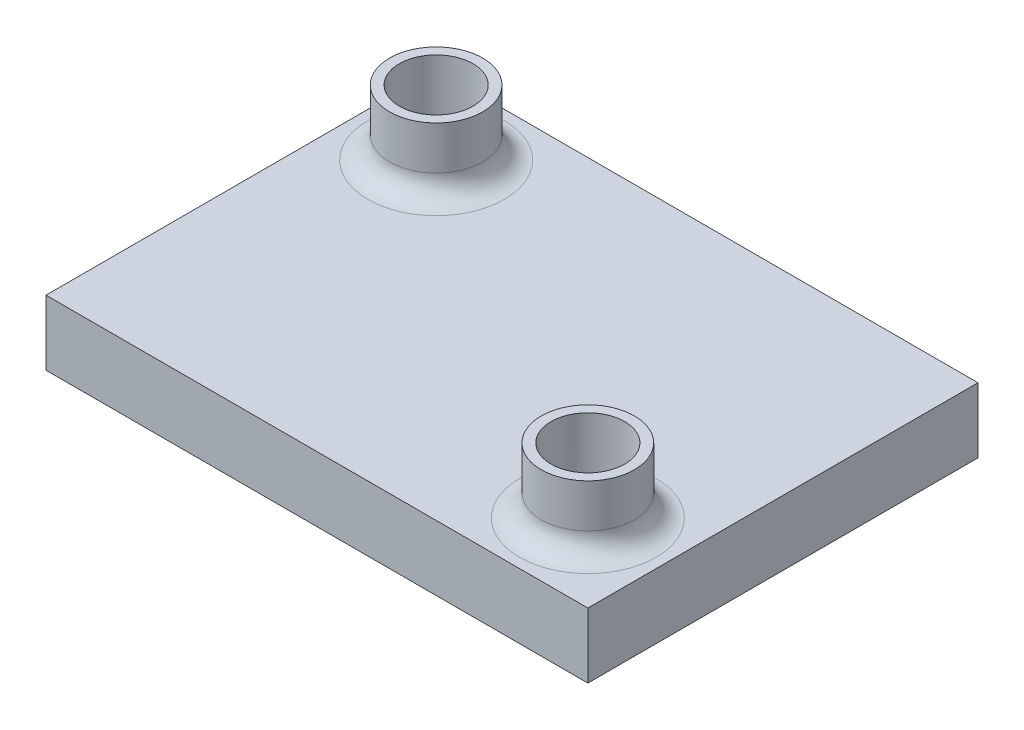
ISO-10303-21;
HEADER;
FILE_DESCRIPTION(('STEP AP214'),'2;1');
FILE_NAME('part.step','',(''),(''),'','','');
FILE_SCHEMA(('AUTOMOTIVE_DESIGN { 1 0 10303 214 1 1 1 1 }'));
ENDSEC;
DATA;
#1=APPLICATION_CONTEXT('core data for automotive mechanical design processes');
#2=APPLICATION_PROTOCOL_DEFINITION('international standard','automotive_design',2000,#1);
#3=PRODUCT_CONTEXT('',#1,'mechanical');
#4=PRODUCT('Part','Part','',(#3));
#5=PRODUCT_RELATED_PRODUCT_CATEGORY('part','',(#4));
#6=PRODUCT_DEFINITION_FORMATION('','',#4);
#7=PRODUCT_DEFINITION_CONTEXT('part definition',#1,'design');
#8=PRODUCT_DEFINITION('design','',#6,#7);
#9=PRODUCT_DEFINITION_SHAPE('','',#8);
#10=(LENGTH_UNIT() NAMED_UNIT(*) SI_UNIT(.MILLI.,.METRE.));
#11=(NAMED_UNIT(*) PLANE_ANGLE_UNIT() SI_UNIT($,.RADIAN.));
#12=(NAMED_UNIT(*) SI_UNIT($,.STERADIAN.) SOLID_ANGLE_UNIT());
#13=UNCERTAINTY_MEASURE_WITH_UNIT(LENGTH_MEASURE(1.E-05),#10,'distance_accuracy_value','');
#14=(GEOMETRIC_REPRESENTATION_CONTEXT(3) GLOBAL_UNCERTAINTY_ASSIGNED_CONTEXT((#13)) GLOBAL_UNIT_ASSIGNED_CONTEXT((#10,
#11,#12)) REPRESENTATION_CONTEXT('',''));
#15=CARTESIAN_POINT('',(0.,0.,0.));
#16=DIRECTION('',(0.,0.,1.));
#17=DIRECTION('',(1.,0.,0.));
#18=AXIS2_PLACEMENT_3D('',#15,#16,#17);
#19=CARTESIAN_POINT('',(-8.89989325778686,0.,-5.4));
#20=DIRECTION('',(0.,1.,0.));
#21=DIRECTION('',(0.,0.,1.));
#22=AXIS2_PLACEMENT_3D('',#19,#20,#21);
#23=CYLINDRICAL_SURFACE('',#22,1.7);
#24=CARTESIAN_POINT('',(-8.89989325778686,6.,-5.4));
#25=DIRECTION('',(0.,1.,0.));
#26=DIRECTION('',(0.,0.,1.));
#27=AXIS2_PLACEMENT_3D('',#24,#25,#26);
#28=CIRCLE('',#27,1.7);
#29=CARTESIAN_POINT('',(-8.89989325778686,6.,-3.7));
#30=VERTEX_POINT('',#29);
#31=EDGE_CURVE('E256',#30,#30,#28,.T.);
#32=ORIENTED_EDGE('',*,*,#31,.T.);
#33=EDGE_LOOP('',(#32));
#34=FACE_BOUND('',#33,.T.);
#35=CARTESIAN_POINT('',(-8.89989325778686,2.,-5.4));
#36=DIRECTION('',(0.,-1.,0.));
#37=DIRECTION('',(0.,0.,-1.));
#38=AXIS2_PLACEMENT_3D('',#35,#36,#37);
#39=CIRCLE('',#38,1.7);
#40=CARTESIAN_POINT('',(-8.89989325778686,2.,-7.1));
#41=VERTEX_POINT('',#40);
#42=EDGE_CURVE('E37',#41,#41,#39,.F.);
#43=ORIENTED_EDGE('',*,*,#42,.F.);
#44=EDGE_LOOP('',(#43));
#45=FACE_BOUND('',#44,.T.);
#46=ADVANCED_FACE('F33',(#34,#45),#23,.F.);
#47=CARTESIAN_POINT('',(8.89989325778686,0.,5.4));
#48=DIRECTION('',(0.,1.,0.));
#49=DIRECTION('',(0.,0.,1.));
#50=AXIS2_PLACEMENT_3D('',#47,#48,#49);
#51=CYLINDRICAL_SURFACE('',#50,1.7);
#52=CARTESIAN_POINT('',(8.89989325778686,6.,5.4));
#53=DIRECTION('',(0.,1.,0.));
#54=DIRECTION('',(0.,0.,1.));
#55=AXIS2_PLACEMENT_3D('',#52,#53,#54);
#56=CIRCLE('',#55,1.7);
#57=CARTESIAN_POINT('',(8.89989325778686,6.,7.1));
#58=VERTEX_POINT('',#57);
#59=EDGE_CURVE('E250',#58,#58,#56,.T.);
#60=ORIENTED_EDGE('',*,*,#59,.T.);
#61=EDGE_LOOP('',(#60));
#62=FACE_BOUND('',#61,.T.);
#63=CARTESIAN_POINT('',(8.89989325778686,2.,5.4));
#64=DIRECTION('',(0.,-1.,0.));
#65=DIRECTION('',(0.,0.,-1.));
#66=AXIS2_PLACEMENT_3D('',#63,#64,#65);
#67=CIRCLE('',#66,1.7);
#68=CARTESIAN_POINT('',(8.89989325778686,2.,3.7));
#69=VERTEX_POINT('',#68);
#70=EDGE_CURVE('E240',#69,#69,#67,.F.);
#71=ORIENTED_EDGE('',*,*,#70,.F.);
#72=EDGE_LOOP('',(#71));
#73=FACE_BOUND('',#72,.T.);
#74=ADVANCED_FACE('F304',(#62,#73),#51,.F.);
#75=CARTESIAN_POINT('',(0.,3.,0.));
#76=DIRECTION('',(0.,1.,0.));
#77=DIRECTION('',(0.,0.,1.));
#78=AXIS2_PLACEMENT_3D('',#75,#76,#77);
#79=PLANE('',#78);
#80=CARTESIAN_POINT('',(8.89989325778686,3.,5.4));
#81=DIRECTION('',(0.,1.,0.));
#82=DIRECTION('',(0.,0.,1.));
#83=AXIS2_PLACEMENT_3D('',#80,#81,#82);
#84=CIRCLE('',#83,3.15);
#85=CARTESIAN_POINT('',(8.89989325778686,3.,8.55));
#86=VERTEX_POINT('',#85);
#87=EDGE_CURVE('E42',#86,#86,#84,.F.);
#88=ORIENTED_EDGE('',*,*,#87,.T.);
#89=EDGE_LOOP('',(#88));
#90=FACE_BOUND('',#89,.T.);
#91=CARTESIAN_POINT('',(-8.89989325778686,3.,-5.4));
#92=DIRECTION('',(0.,1.,0.));
#93=DIRECTION('',(0.,0.,1.));
#94=AXIS2_PLACEMENT_3D('',#91,#92,#93);
#95=CIRCLE('',#94,3.15);
#96=CARTESIAN_POINT('',(-8.89989325778686,3.,-2.25));
#97=VERTEX_POINT('',#96);
#98=EDGE_CURVE('E295',#97,#97,#95,.F.);
#99=ORIENTED_EDGE('',*,*,#98,.T.);
#100=EDGE_LOOP('',(#99));
#101=FACE_BOUND('',#100,.T.);
#102=DIRECTION('',(0.,0.,1.));
#103=VECTOR('',#102,1.);
#104=CARTESIAN_POINT('',(-12.5,3.,-9.));
#105=LINE('',#104,#103);
#106=CARTESIAN_POINT('',(-12.5,3.,-9.));
#107=VERTEX_POINT('',#106);
#108=CARTESIAN_POINT('',(-12.5,3.,9.));
#109=VERTEX_POINT('',#108);
#110=EDGE_CURVE('E263',#107,#109,#105,.T.);
#111=ORIENTED_EDGE('',*,*,#110,.T.);
#112=DIRECTION('',(1.,0.,0.));
#113=VECTOR('',#112,1.);
#114=CARTESIAN_POINT('',(-12.5,3.,9.));
#115=LINE('',#114,#113);
#116=CARTESIAN_POINT('',(12.5,3.,9.));
#117=VERTEX_POINT('',#116);
#118=EDGE_CURVE('E266',#109,#117,#115,.T.);
#119=ORIENTED_EDGE('',*,*,#118,.T.);
#120=DIRECTION('',(0.,0.,-1.));
#121=VECTOR('',#120,1.);
#122=CARTESIAN_POINT('',(12.5,3.,-9.));
#123=LINE('',#122,#121);
#124=CARTESIAN_POINT('',(12.5,3.,-9.));
#125=VERTEX_POINT('',#124);
#126=EDGE_CURVE('E269',#117,#125,#123,.T.);
#127=ORIENTED_EDGE('',*,*,#126,.T.);
#128=DIRECTION('',(-1.,0.,0.));
#129=VECTOR('',#128,1.);
#130=CARTESIAN_POINT('',(-12.5,3.,-9.));
#131=LINE('',#130,#129);
#132=EDGE_CURVE('E271',#125,#107,#131,.T.);
#133=ORIENTED_EDGE('',*,*,#132,.T.);
#134=EDGE_LOOP('',(#111,#119,#127,#133));
#135=FACE_BOUND('',#134,.T.);
#136=ADVANCED_FACE('F306',(#90,#101,#135),#79,.T.);
#137=CARTESIAN_POINT('',(-12.5,3.,-9.));
#138=DIRECTION('',(1.,0.,0.));
#139=DIRECTION('',(0.,0.,-1.));
#140=AXIS2_PLACEMENT_3D('',#137,#138,#139);
#141=PLANE('',#140);
#142=DIRECTION('',(0.,0.,1.));
#143=VECTOR('',#142,1.);
#144=CARTESIAN_POINT('',(-12.5,0.,-9.));
#145=LINE('',#144,#143);
#146=CARTESIAN_POINT('',(-12.5,0.,-9.));
#147=VERTEX_POINT('',#146);
#148=CARTESIAN_POINT('',(-12.5,0.,9.));
#149=VERTEX_POINT('',#148);
#150=EDGE_CURVE('E262',#147,#149,#145,.T.);
#151=ORIENTED_EDGE('',*,*,#150,.T.);
#152=DIRECTION('',(0.,-1.,0.));
#153=VECTOR('',#152,1.);
#154=CARTESIAN_POINT('',(-12.5,3.,9.));
#155=LINE('',#154,#153);
#156=EDGE_CURVE('E289',#109,#149,#155,.T.);
#157=ORIENTED_EDGE('',*,*,#156,.F.);
#158=ORIENTED_EDGE('',*,*,#110,.F.);
#159=DIRECTION('',(0.,-1.,0.));
#160=VECTOR('',#159,1.);
#161=CARTESIAN_POINT('',(-12.5,3.,-9.));
#162=LINE('',#161,#160);
#163=EDGE_CURVE('E273',#107,#147,#162,.T.);
#164=ORIENTED_EDGE('',*,*,#163,.T.);
#165=EDGE_LOOP('',(#151,#157,#158,#164));
#166=FACE_BOUND('',#165,.T.);
#167=ADVANCED_FACE('F313',(#166),#141,.F.);
#168=CARTESIAN_POINT('',(-12.5,3.,9.));
#169=DIRECTION('',(0.,0.,-1.));
#170=DIRECTION('',(-1.,0.,0.));
#171=AXIS2_PLACEMENT_3D('',#168,#169,#170);
#172=PLANE('',#171);
#173=DIRECTION('',(1.,0.,0.));
#174=VECTOR('',#173,1.);
#175=CARTESIAN_POINT('',(-12.5,0.,9.));
#176=LINE('',#175,#174);
#177=CARTESIAN_POINT('',(12.5,0.,9.));
#178=VERTEX_POINT('',#177);
#179=EDGE_CURVE('E276',#149,#178,#176,.T.);
#180=ORIENTED_EDGE('',*,*,#179,.T.);
#181=DIRECTION('',(0.,-1.,0.));
#182=VECTOR('',#181,1.);
#183=CARTESIAN_POINT('',(12.5,3.,9.));
#184=LINE('',#183,#182);
#185=EDGE_CURVE('E286',#117,#178,#184,.T.);
#186=ORIENTED_EDGE('',*,*,#185,.F.);
#187=ORIENTED_EDGE('',*,*,#118,.F.);
#188=ORIENTED_EDGE('',*,*,#156,.T.);
#189=EDGE_LOOP('',(#180,#186,#187,#188));
#190=FACE_BOUND('',#189,.T.);
#191=ADVANCED_FACE('F334',(#190),#172,.F.);
#192=CARTESIAN_POINT('',(12.5,3.,-9.));
#193=DIRECTION('',(-1.,0.,0.));
#194=DIRECTION('',(0.,0.,1.));
#195=AXIS2_PLACEMENT_3D('',#192,#193,#194);
#196=PLANE('',#195);
#197=DIRECTION('',(0.,0.,-1.));
#198=VECTOR('',#197,1.);
#199=CARTESIAN_POINT('',(12.5,0.,-9.));
#200=LINE('',#199,#198);
#201=CARTESIAN_POINT('',(12.5,0.,-9.));
#202=VERTEX_POINT('',#201);
#203=EDGE_CURVE('E278',#178,#202,#200,.T.);
#204=ORIENTED_EDGE('',*,*,#203,.T.);
#205=DIRECTION('',(0.,-1.,0.));
#206=VECTOR('',#205,1.);
#207=CARTESIAN_POINT('',(12.5,3.,-9.));
#208=LINE('',#207,#206);
#209=EDGE_CURVE('E283',#125,#202,#208,.T.);
#210=ORIENTED_EDGE('',*,*,#209,.F.);
#211=ORIENTED_EDGE('',*,*,#126,.F.);
#212=ORIENTED_EDGE('',*,*,#185,.T.);
#213=EDGE_LOOP('',(#204,#210,#211,#212));
#214=FACE_BOUND('',#213,.T.);
#215=ADVANCED_FACE('F330',(#214),#196,.F.);
#216=CARTESIAN_POINT('',(-12.5,3.,-9.));
#217=DIRECTION('',(0.,0.,1.));
#218=DIRECTION('',(1.,0.,0.));
#219=AXIS2_PLACEMENT_3D('',#216,#217,#218);
#220=PLANE('',#219);
#221=DIRECTION('',(-1.,0.,0.));
#222=VECTOR('',#221,1.);
#223=CARTESIAN_POINT('',(-12.5,0.,-9.));
#224=LINE('',#223,#222);
#225=EDGE_CURVE('E267',#202,#147,#224,.T.);
#226=ORIENTED_EDGE('',*,*,#225,.T.);
#227=ORIENTED_EDGE('',*,*,#163,.F.);
#228=ORIENTED_EDGE('',*,*,#132,.F.);
#229=ORIENTED_EDGE('',*,*,#209,.T.);
#230=EDGE_LOOP('',(#226,#227,#228,#229));
#231=FACE_BOUND('',#230,.T.);
#232=ADVANCED_FACE('F326',(#231),#220,.F.);
#233=CARTESIAN_POINT('',(0.,0.,0.));
#234=DIRECTION('',(0.,1.,0.));
#235=DIRECTION('',(0.,0.,1.));
#236=AXIS2_PLACEMENT_3D('',#233,#234,#235);
#237=PLANE('',#236);
#238=DIRECTION('',(0.5,0.,0.866025403784439));
#239=VECTOR('',#238,1.);
#240=CARTESIAN_POINT('',(-7.25444499059643,0.,-8.25));
#241=LINE('',#240,#239);
#242=CARTESIAN_POINT('',(-7.25444499059643,0.,-8.25));
#243=VERTEX_POINT('',#242);
#244=CARTESIAN_POINT('',(-5.60899672340599,0.,-5.4));
#245=VERTEX_POINT('',#244);
#246=EDGE_CURVE('E184',#243,#245,#241,.T.);
#247=ORIENTED_EDGE('',*,*,#246,.F.);
#248=DIRECTION('',(1.,0.,0.));
#249=VECTOR('',#248,1.);
#250=CARTESIAN_POINT('',(-10.5453415249773,0.,-8.25));
#251=LINE('',#250,#249);
#252=CARTESIAN_POINT('',(-10.5453415249773,0.,-8.25));
#253=VERTEX_POINT('',#252);
#254=EDGE_CURVE('E50',#253,#243,#251,.T.);
#255=ORIENTED_EDGE('',*,*,#254,.F.);
#256=DIRECTION('',(0.5,0.,-0.866025403784439));
#257=VECTOR('',#256,1.);
#258=CARTESIAN_POINT('',(-12.1907897921677,0.,-5.4));
#259=LINE('',#258,#257);
#260=CARTESIAN_POINT('',(-12.1907897921677,0.,-5.4));
#261=VERTEX_POINT('',#260);
#262=EDGE_CURVE('E170',#261,#253,#259,.T.);
#263=ORIENTED_EDGE('',*,*,#262,.F.);
#264=DIRECTION('',(-0.5,0.,-0.866025403784439));
#265=VECTOR('',#264,1.);
#266=CARTESIAN_POINT('',(-10.5453415249773,0.,-2.55));
#267=LINE('',#266,#265);
#268=CARTESIAN_POINT('',(-10.5453415249773,0.,-2.55));
#269=VERTEX_POINT('',#268);
#270=EDGE_CURVE('E173',#269,#261,#267,.T.);
#271=ORIENTED_EDGE('',*,*,#270,.F.);
#272=DIRECTION('',(-1.,0.,0.));
#273=VECTOR('',#272,1.);
#274=CARTESIAN_POINT('',(-7.25444499059643,0.,-2.55));
#275=LINE('',#274,#273);
#276=CARTESIAN_POINT('',(-7.25444499059643,0.,-2.55));
#277=VERTEX_POINT('',#276);
#278=EDGE_CURVE('E189',#277,#269,#275,.T.);
#279=ORIENTED_EDGE('',*,*,#278,.F.);
#280=DIRECTION('',(-0.5,0.,0.866025403784439));
#281=VECTOR('',#280,1.);
#282=CARTESIAN_POINT('',(-5.60899672340599,0.,-5.4));
#283=LINE('',#282,#281);
#284=EDGE_CURVE('E186',#245,#277,#283,.T.);
#285=ORIENTED_EDGE('',*,*,#284,.F.);
#286=EDGE_LOOP('',(#247,#255,#263,#271,#279,#285));
#287=FACE_BOUND('',#286,.T.);
#288=DIRECTION('',(0.5,0.,0.866025403784438));
#289=VECTOR('',#288,1.);
#290=CARTESIAN_POINT('',(10.5453415249773,0.,2.55));
#291=LINE('',#290,#289);
#292=CARTESIAN_POINT('',(10.5453415249773,0.,2.55));
#293=VERTEX_POINT('',#292);
#294=CARTESIAN_POINT('',(12.1907897921677,0.,5.4));
#295=VERTEX_POINT('',#294);
#296=EDGE_CURVE('E224',#293,#295,#291,.T.);
#297=ORIENTED_EDGE('',*,*,#296,.F.);
#298=DIRECTION('',(1.,0.,0.));
#299=VECTOR('',#298,1.);
#300=CARTESIAN_POINT('',(7.25444499059642,0.,2.55));
#301=LINE('',#300,#299);
#302=CARTESIAN_POINT('',(7.25444499059642,0.,2.55));
#303=VERTEX_POINT('',#302);
#304=EDGE_CURVE('E58',#303,#293,#301,.T.);
#305=ORIENTED_EDGE('',*,*,#304,.F.);
#306=DIRECTION('',(0.5,0.,-0.866025403784439));
#307=VECTOR('',#306,1.);
#308=CARTESIAN_POINT('',(5.60899672340599,0.,5.4));
#309=LINE('',#308,#307);
#310=CARTESIAN_POINT('',(5.60899672340599,0.,5.4));
#311=VERTEX_POINT('',#310);
#312=EDGE_CURVE('E207',#311,#303,#309,.T.);
#313=ORIENTED_EDGE('',*,*,#312,.F.);
#314=DIRECTION('',(-0.5,0.,-0.866025403784438));
#315=VECTOR('',#314,1.);
#316=CARTESIAN_POINT('',(7.25444499059642,0.,8.25));
#317=LINE('',#316,#315);
#318=CARTESIAN_POINT('',(7.25444499059642,0.,8.25));
#319=VERTEX_POINT('',#318);
#320=EDGE_CURVE('E233',#319,#311,#317,.T.);
#321=ORIENTED_EDGE('',*,*,#320,.F.);
#322=DIRECTION('',(-1.,0.,0.));
#323=VECTOR('',#322,1.);
#324=CARTESIAN_POINT('',(10.5453415249773,0.,8.25));
#325=LINE('',#324,#323);
#326=CARTESIAN_POINT('',(10.5453415249773,0.,8.25));
#327=VERTEX_POINT('',#326);
#328=EDGE_CURVE('E230',#327,#319,#325,.T.);
#329=ORIENTED_EDGE('',*,*,#328,.F.);
#330=DIRECTION('',(-0.5,0.,0.866025403784439));
#331=VECTOR('',#330,1.);
#332=CARTESIAN_POINT('',(12.1907897921677,0.,5.4));
#333=LINE('',#332,#331);
#334=EDGE_CURVE('E227',#295,#327,#333,.T.);
#335=ORIENTED_EDGE('',*,*,#334,.F.);
#336=EDGE_LOOP('',(#297,#305,#313,#321,#329,#335));
#337=FACE_BOUND('',#336,.T.);
#338=ORIENTED_EDGE('',*,*,#150,.F.);
#339=ORIENTED_EDGE('',*,*,#225,.F.);
#340=ORIENTED_EDGE('',*,*,#203,.F.);
#341=ORIENTED_EDGE('',*,*,#179,.F.);
#342=EDGE_LOOP('',(#338,#339,#340,#341));
#343=FACE_BOUND('',#342,.T.);
#344=ADVANCED_FACE('F322',(#287,#337,#343),#237,.F.);
#345=CARTESIAN_POINT('',(-8.89989325778686,6.,-5.4));
#346=DIRECTION('',(0.,1.,0.));
#347=DIRECTION('',(0.,0.,1.));
#348=AXIS2_PLACEMENT_3D('',#345,#346,#347);
#349=PLANE('',#348);
#350=CARTESIAN_POINT('',(-8.89989325778686,6.,-5.4));
#351=DIRECTION('',(0.,1.,0.));
#352=DIRECTION('',(0.,0.,1.));
#353=AXIS2_PLACEMENT_3D('',#350,#351,#352);
#354=CIRCLE('',#353,2.15);
#355=CARTESIAN_POINT('',(-8.89989325778686,6.,-3.25));
#356=VERTEX_POINT('',#355);
#357=EDGE_CURVE('E259',#356,#356,#354,.T.);
#358=ORIENTED_EDGE('',*,*,#357,.T.);
#359=EDGE_LOOP('',(#358));
#360=FACE_BOUND('',#359,.T.);
#361=ORIENTED_EDGE('',*,*,#31,.F.);
#362=EDGE_LOOP('',(#361));
#363=FACE_BOUND('',#362,.T.);
#364=ADVANCED_FACE('F325',(#360,#363),#349,.T.);
#365=CARTESIAN_POINT('',(-8.89989325778686,6.,-5.4));
#366=DIRECTION('',(0.,-1.,0.));
#367=DIRECTION('',(0.,0.,-1.));
#368=AXIS2_PLACEMENT_3D('',#365,#366,#367);
#369=CYLINDRICAL_SURFACE('',#368,2.15);
#370=CARTESIAN_POINT('',(-8.89989325778686,4.,-5.4));
#371=DIRECTION('',(0.,1.,0.));
#372=DIRECTION('',(0.,0.,1.));
#373=AXIS2_PLACEMENT_3D('',#370,#371,#372);
#374=CIRCLE('',#373,2.15);
#375=CARTESIAN_POINT('',(-8.89989325778686,4.,-3.25));
#376=VERTEX_POINT('',#375);
#377=EDGE_CURVE('E11',#376,#376,#374,.T.);
#378=ORIENTED_EDGE('',*,*,#377,.T.);
#379=EDGE_LOOP('',(#378));
#380=FACE_BOUND('',#379,.T.);
#381=ORIENTED_EDGE('',*,*,#357,.F.);
#382=EDGE_LOOP('',(#381));
#383=FACE_BOUND('',#382,.T.);
#384=ADVANCED_FACE('F319',(#380,#383),#369,.T.);
#385=CARTESIAN_POINT('',(8.89989325778686,6.,5.4));
#386=DIRECTION('',(0.,1.,0.));
#387=DIRECTION('',(0.,0.,1.));
#388=AXIS2_PLACEMENT_3D('',#385,#386,#387);
#389=PLANE('',#388);
#390=CARTESIAN_POINT('',(8.89989325778686,6.,5.4));
#391=DIRECTION('',(0.,1.,0.));
#392=DIRECTION('',(0.,0.,1.));
#393=AXIS2_PLACEMENT_3D('',#390,#391,#392);
#394=CIRCLE('',#393,2.15);
#395=CARTESIAN_POINT('',(8.89989325778686,6.,7.55));
#396=VERTEX_POINT('',#395);
#397=EDGE_CURVE('E253',#396,#396,#394,.T.);
#398=ORIENTED_EDGE('',*,*,#397,.T.);
#399=EDGE_LOOP('',(#398));
#400=FACE_BOUND('',#399,.T.);
#401=ORIENTED_EDGE('',*,*,#59,.F.);
#402=EDGE_LOOP('',(#401));
#403=FACE_BOUND('',#402,.T.);
#404=ADVANCED_FACE('F350',(#400,#403),#389,.T.);
#405=CARTESIAN_POINT('',(8.89989325778686,6.,5.4));
#406=DIRECTION('',(0.,-1.,0.));
#407=DIRECTION('',(0.,0.,-1.));
#408=AXIS2_PLACEMENT_3D('',#405,#406,#407);
#409=CYLINDRICAL_SURFACE('',#408,2.15);
#410=CARTESIAN_POINT('',(8.89989325778686,4.,5.4));
#411=DIRECTION('',(0.,1.,0.));
#412=DIRECTION('',(0.,0.,1.));
#413=AXIS2_PLACEMENT_3D('',#410,#411,#412);
#414=CIRCLE('',#413,2.15);
#415=CARTESIAN_POINT('',(8.89989325778686,4.,7.55));
#416=VERTEX_POINT('',#415);
#417=EDGE_CURVE('E292',#416,#416,#414,.T.);
#418=ORIENTED_EDGE('',*,*,#417,.T.);
#419=EDGE_LOOP('',(#418));
#420=FACE_BOUND('',#419,.T.);
#421=ORIENTED_EDGE('',*,*,#397,.F.);
#422=EDGE_LOOP('',(#421));
#423=FACE_BOUND('',#422,.T.);
#424=ADVANCED_FACE('F343',(#420,#423),#409,.T.);
#425=CARTESIAN_POINT('',(8.89989325778686,4.,5.4));
#426=DIRECTION('',(0.,1.,0.));
#427=DIRECTION('',(0.,0.,1.));
#428=AXIS2_PLACEMENT_3D('',#425,#426,#427);
#429=TOROIDAL_SURFACE('',#428,3.15,1.);
#430=ORIENTED_EDGE('',*,*,#87,.F.);
#431=EDGE_LOOP('',(#430));
#432=FACE_BOUND('',#431,.T.);
#433=ORIENTED_EDGE('',*,*,#417,.F.);
#434=EDGE_LOOP('',(#433));
#435=FACE_BOUND('',#434,.T.);
#436=ADVANCED_FACE('F341',(#432,#435),#429,.F.);
#437=CARTESIAN_POINT('',(-8.89989325778686,4.,-5.4));
#438=DIRECTION('',(0.,1.,0.));
#439=DIRECTION('',(0.,0.,1.));
#440=AXIS2_PLACEMENT_3D('',#437,#438,#439);
#441=TOROIDAL_SURFACE('',#440,3.15,1.);
#442=ORIENTED_EDGE('',*,*,#98,.F.);
#443=EDGE_LOOP('',(#442));
#444=FACE_BOUND('',#443,.T.);
#445=ORIENTED_EDGE('',*,*,#377,.F.);
#446=EDGE_LOOP('',(#445));
#447=FACE_BOUND('',#446,.T.);
#448=ADVANCED_FACE('F35',(#444,#447),#441,.F.);
#449=CARTESIAN_POINT('',(0.,2.,0.));
#450=DIRECTION('',(0.,-1.,0.));
#451=DIRECTION('',(0.,0.,-1.));
#452=AXIS2_PLACEMENT_3D('',#449,#450,#451);
#453=PLANE('',#452);
#454=DIRECTION('',(1.,0.,0.));
#455=VECTOR('',#454,1.);
#456=CARTESIAN_POINT('',(7.25444499059642,2.,2.55));
#457=LINE('',#456,#455);
#458=CARTESIAN_POINT('',(7.25444499059642,2.,2.55));
#459=VERTEX_POINT('',#458);
#460=CARTESIAN_POINT('',(10.5453415249773,2.,2.55));
#461=VERTEX_POINT('',#460);
#462=EDGE_CURVE('E203',#459,#461,#457,.T.);
#463=ORIENTED_EDGE('',*,*,#462,.T.);
#464=DIRECTION('',(0.5,0.,0.866025403784438));
#465=VECTOR('',#464,1.);
#466=CARTESIAN_POINT('',(10.5453415249773,2.,2.55));
#467=LINE('',#466,#465);
#468=CARTESIAN_POINT('',(12.1907897921677,2.,5.4));
#469=VERTEX_POINT('',#468);
#470=EDGE_CURVE('E206',#461,#469,#467,.T.);
#471=ORIENTED_EDGE('',*,*,#470,.T.);
#472=DIRECTION('',(-0.5,0.,0.866025403784439));
#473=VECTOR('',#472,1.);
#474=CARTESIAN_POINT('',(12.1907897921677,2.,5.4));
#475=LINE('',#474,#473);
#476=CARTESIAN_POINT('',(10.5453415249773,2.,8.25));
#477=VERTEX_POINT('',#476);
#478=EDGE_CURVE('E210',#469,#477,#475,.T.);
#479=ORIENTED_EDGE('',*,*,#478,.T.);
#480=DIRECTION('',(-1.,0.,0.));
#481=VECTOR('',#480,1.);
#482=CARTESIAN_POINT('',(10.5453415249773,2.,8.25));
#483=LINE('',#482,#481);
#484=CARTESIAN_POINT('',(7.25444499059642,2.,8.25));
#485=VERTEX_POINT('',#484);
#486=EDGE_CURVE('E213',#477,#485,#483,.T.);
#487=ORIENTED_EDGE('',*,*,#486,.T.);
#488=DIRECTION('',(-0.5,0.,-0.866025403784438));
#489=VECTOR('',#488,1.);
#490=CARTESIAN_POINT('',(7.25444499059642,2.,8.25));
#491=LINE('',#490,#489);
#492=CARTESIAN_POINT('',(5.60899672340599,2.,5.4));
#493=VERTEX_POINT('',#492);
#494=EDGE_CURVE('E216',#485,#493,#491,.T.);
#495=ORIENTED_EDGE('',*,*,#494,.T.);
#496=DIRECTION('',(0.5,0.,-0.866025403784439));
#497=VECTOR('',#496,1.);
#498=CARTESIAN_POINT('',(5.60899672340599,2.,5.4));
#499=LINE('',#498,#497);
#500=EDGE_CURVE('E219',#493,#459,#499,.T.);
#501=ORIENTED_EDGE('',*,*,#500,.T.);
#502=EDGE_LOOP('',(#463,#471,#479,#487,#495,#501));
#503=FACE_BOUND('',#502,.T.);
#504=ORIENTED_EDGE('',*,*,#70,.T.);
#505=EDGE_LOOP('',(#504));
#506=FACE_BOUND('',#505,.T.);
#507=ADVANCED_FACE('F302',(#503,#506),#453,.T.);
#508=CARTESIAN_POINT('',(7.25444499059642,2.,2.55));
#509=DIRECTION('',(0.,0.,-1.));
#510=DIRECTION('',(-1.,0.,0.));
#511=AXIS2_PLACEMENT_3D('',#508,#509,#510);
#512=PLANE('',#511);
#513=ORIENTED_EDGE('',*,*,#304,.T.);
#514=DIRECTION('',(0.,-1.,0.));
#515=VECTOR('',#514,1.);
#516=CARTESIAN_POINT('',(10.5453415249773,2.,2.55));
#517=LINE('',#516,#515);
#518=EDGE_CURVE('E222',#461,#293,#517,.T.);
#519=ORIENTED_EDGE('',*,*,#518,.F.);
#520=ORIENTED_EDGE('',*,*,#462,.F.);
#521=DIRECTION('',(0.,-1.,0.));
#522=VECTOR('',#521,1.);
#523=CARTESIAN_POINT('',(7.25444499059642,2.,2.55));
#524=LINE('',#523,#522);
#525=EDGE_CURVE('E238',#459,#303,#524,.T.);
#526=ORIENTED_EDGE('',*,*,#525,.T.);
#527=EDGE_LOOP('',(#513,#519,#520,#526));
#528=FACE_BOUND('',#527,.T.);
#529=ADVANCED_FACE('F368',(#528),#512,.F.);
#530=CARTESIAN_POINT('',(5.60899672340599,2.,5.4));
#531=DIRECTION('',(-0.866025403784439,0.,-0.499999999999999));
#532=DIRECTION('',(-0.499999999999999,0.,0.866025403784439));
#533=AXIS2_PLACEMENT_3D('',#530,#531,#532);
#534=PLANE('',#533);
#535=ORIENTED_EDGE('',*,*,#312,.T.);
#536=ORIENTED_EDGE('',*,*,#525,.F.);
#537=ORIENTED_EDGE('',*,*,#500,.F.);
#538=DIRECTION('',(0.,-1.,0.));
#539=VECTOR('',#538,1.);
#540=CARTESIAN_POINT('',(5.60899672340599,2.,5.4));
#541=LINE('',#540,#539);
#542=EDGE_CURVE('E241',#493,#311,#541,.T.);
#543=ORIENTED_EDGE('',*,*,#542,.T.);
#544=EDGE_LOOP('',(#535,#536,#537,#543));
#545=FACE_BOUND('',#544,.T.);
#546=ADVANCED_FACE('F412',(#545),#534,.F.);
#547=CARTESIAN_POINT('',(7.25444499059642,2.,8.25));
#548=DIRECTION('',(-0.866025403784438,0.,0.5));
#549=DIRECTION('',(0.5,0.,0.866025403784438));
#550=AXIS2_PLACEMENT_3D('',#547,#548,#549);
#551=PLANE('',#550);
#552=ORIENTED_EDGE('',*,*,#320,.T.);
#553=ORIENTED_EDGE('',*,*,#542,.F.);
#554=ORIENTED_EDGE('',*,*,#494,.F.);
#555=DIRECTION('',(0.,-1.,0.));
#556=VECTOR('',#555,1.);
#557=CARTESIAN_POINT('',(7.25444499059642,2.,8.25));
#558=LINE('',#557,#556);
#559=EDGE_CURVE('E243',#485,#319,#558,.T.);
#560=ORIENTED_EDGE('',*,*,#559,.T.);
#561=EDGE_LOOP('',(#552,#553,#554,#560));
#562=FACE_BOUND('',#561,.T.);
#563=ADVANCED_FACE('F415',(#562),#551,.F.);
#564=CARTESIAN_POINT('',(10.5453415249773,2.,8.25));
#565=DIRECTION('',(0.,0.,1.));
#566=DIRECTION('',(1.,0.,0.));
#567=AXIS2_PLACEMENT_3D('',#564,#565,#566);
#568=PLANE('',#567);
#569=ORIENTED_EDGE('',*,*,#328,.T.);
#570=ORIENTED_EDGE('',*,*,#559,.F.);
#571=ORIENTED_EDGE('',*,*,#486,.F.);
#572=DIRECTION('',(0.,-1.,0.));
#573=VECTOR('',#572,1.);
#574=CARTESIAN_POINT('',(10.5453415249773,2.,8.25));
#575=LINE('',#574,#573);
#576=EDGE_CURVE('E245',#477,#327,#575,.T.);
#577=ORIENTED_EDGE('',*,*,#576,.T.);
#578=EDGE_LOOP('',(#569,#570,#571,#577));
#579=FACE_BOUND('',#578,.T.);
#580=ADVANCED_FACE('F419',(#579),#568,.F.);
#581=CARTESIAN_POINT('',(12.1907897921677,2.,5.4));
#582=DIRECTION('',(0.866025403784439,0.,0.5));
#583=DIRECTION('',(0.5,0.,-0.866025403784439));
#584=AXIS2_PLACEMENT_3D('',#581,#582,#583);
#585=PLANE('',#584);
#586=ORIENTED_EDGE('',*,*,#334,.T.);
#587=ORIENTED_EDGE('',*,*,#576,.F.);
#588=ORIENTED_EDGE('',*,*,#478,.F.);
#589=DIRECTION('',(0.,-1.,0.));
#590=VECTOR('',#589,1.);
#591=CARTESIAN_POINT('',(12.1907897921677,2.,5.4));
#592=LINE('',#591,#590);
#593=EDGE_CURVE('E247',#469,#295,#592,.T.);
#594=ORIENTED_EDGE('',*,*,#593,.T.);
#595=EDGE_LOOP('',(#586,#587,#588,#594));
#596=FACE_BOUND('',#595,.T.);
#597=ADVANCED_FACE('F389',(#596),#585,.F.);
#598=CARTESIAN_POINT('',(10.5453415249773,2.,2.55));
#599=DIRECTION('',(0.866025403784438,0.,-0.5));
#600=DIRECTION('',(-0.5,0.,-0.866025403784438));
#601=AXIS2_PLACEMENT_3D('',#598,#599,#600);
#602=PLANE('',#601);
#603=ORIENTED_EDGE('',*,*,#296,.T.);
#604=ORIENTED_EDGE('',*,*,#593,.F.);
#605=ORIENTED_EDGE('',*,*,#470,.F.);
#606=ORIENTED_EDGE('',*,*,#518,.T.);
#607=EDGE_LOOP('',(#603,#604,#605,#606));
#608=FACE_BOUND('',#607,.T.);
#609=ADVANCED_FACE('F381',(#608),#602,.F.);
#610=CARTESIAN_POINT('',(0.,2.,0.));
#611=DIRECTION('',(0.,-1.,0.));
#612=DIRECTION('',(0.,0.,-1.));
#613=AXIS2_PLACEMENT_3D('',#610,#611,#612);
#614=PLANE('',#613);
#615=DIRECTION('',(1.,0.,0.));
#616=VECTOR('',#615,1.);
#617=CARTESIAN_POINT('',(-10.5453415249773,2.,-8.25));
#618=LINE('',#617,#616);
#619=CARTESIAN_POINT('',(-10.5453415249773,2.,-8.25));
#620=VERTEX_POINT('',#619);
#621=CARTESIAN_POINT('',(-7.25444499059643,2.,-8.25));
#622=VERTEX_POINT('',#621);
#623=EDGE_CURVE('E150',#620,#622,#618,.T.);
#624=ORIENTED_EDGE('',*,*,#623,.T.);
#625=DIRECTION('',(0.5,0.,0.866025403784439));
#626=VECTOR('',#625,1.);
#627=CARTESIAN_POINT('',(-7.25444499059643,2.,-8.25));
#628=LINE('',#627,#626);
#629=CARTESIAN_POINT('',(-5.60899672340599,2.,-5.4));
#630=VERTEX_POINT('',#629);
#631=EDGE_CURVE('E159',#622,#630,#628,.T.);
#632=ORIENTED_EDGE('',*,*,#631,.T.);
#633=DIRECTION('',(-0.5,0.,0.866025403784439));
#634=VECTOR('',#633,1.);
#635=CARTESIAN_POINT('',(-5.60899672340599,2.,-5.4));
#636=LINE('',#635,#634);
#637=CARTESIAN_POINT('',(-7.25444499059643,2.,-2.55));
#638=VERTEX_POINT('',#637);
#639=EDGE_CURVE('E164',#630,#638,#636,.T.);
#640=ORIENTED_EDGE('',*,*,#639,.T.);
#641=DIRECTION('',(-1.,0.,0.));
#642=VECTOR('',#641,1.);
#643=CARTESIAN_POINT('',(-7.25444499059643,2.,-2.55));
#644=LINE('',#643,#642);
#645=CARTESIAN_POINT('',(-10.5453415249773,2.,-2.55));
#646=VERTEX_POINT('',#645);
#647=EDGE_CURVE('E177',#638,#646,#644,.T.);
#648=ORIENTED_EDGE('',*,*,#647,.T.);
#649=DIRECTION('',(-0.5,0.,-0.866025403784439));
#650=VECTOR('',#649,1.);
#651=CARTESIAN_POINT('',(-10.5453415249773,2.,-2.55));
#652=LINE('',#651,#650);
#653=CARTESIAN_POINT('',(-12.1907897921677,2.,-5.4));
#654=VERTEX_POINT('',#653);
#655=EDGE_CURVE('E180',#646,#654,#652,.T.);
#656=ORIENTED_EDGE('',*,*,#655,.T.);
#657=DIRECTION('',(0.5,0.,-0.866025403784439));
#658=VECTOR('',#657,1.);
#659=CARTESIAN_POINT('',(-12.1907897921677,2.,-5.4));
#660=LINE('',#659,#658);
#661=EDGE_CURVE('E156',#654,#620,#660,.T.);
#662=ORIENTED_EDGE('',*,*,#661,.T.);
#663=EDGE_LOOP('',(#624,#632,#640,#648,#656,#662));
#664=FACE_BOUND('',#663,.T.);
#665=ORIENTED_EDGE('',*,*,#42,.T.);
#666=EDGE_LOOP('',(#665));
#667=FACE_BOUND('',#666,.T.);
#668=ADVANCED_FACE('F166',(#664,#667),#614,.T.);
#669=CARTESIAN_POINT('',(-10.5453415249773,2.,-8.25));
#670=DIRECTION('',(0.,0.,-1.));
#671=DIRECTION('',(-1.,0.,0.));
#672=AXIS2_PLACEMENT_3D('',#669,#670,#671);
#673=PLANE('',#672);
#674=ORIENTED_EDGE('',*,*,#254,.T.);
#675=DIRECTION('',(0.,-1.,0.));
#676=VECTOR('',#675,1.);
#677=CARTESIAN_POINT('',(-7.25444499059643,2.,-8.25));
#678=LINE('',#677,#676);
#679=EDGE_CURVE('E146',#622,#243,#678,.T.);
#680=ORIENTED_EDGE('',*,*,#679,.F.);
#681=ORIENTED_EDGE('',*,*,#623,.F.);
#682=DIRECTION('',(0.,-1.,0.));
#683=VECTOR('',#682,1.);
#684=CARTESIAN_POINT('',(-10.5453415249773,2.,-8.25));
#685=LINE('',#684,#683);
#686=EDGE_CURVE('E194',#620,#253,#685,.T.);
#687=ORIENTED_EDGE('',*,*,#686,.T.);
#688=EDGE_LOOP('',(#674,#680,#681,#687));
#689=FACE_BOUND('',#688,.T.);
#690=ADVANCED_FACE('F148',(#689),#673,.F.);
#691=CARTESIAN_POINT('',(-12.1907897921677,2.,-5.4));
#692=DIRECTION('',(-0.866025403784439,0.,-0.5));
#693=DIRECTION('',(-0.5,0.,0.866025403784439));
#694=AXIS2_PLACEMENT_3D('',#691,#692,#693);
#695=PLANE('',#694);
#696=ORIENTED_EDGE('',*,*,#262,.T.);
#697=ORIENTED_EDGE('',*,*,#686,.F.);
#698=ORIENTED_EDGE('',*,*,#661,.F.);
#699=DIRECTION('',(0.,-1.,0.));
#700=VECTOR('',#699,1.);
#701=CARTESIAN_POINT('',(-12.1907897921677,2.,-5.4));
#702=LINE('',#701,#700);
#703=EDGE_CURVE('E196',#654,#261,#702,.T.);
#704=ORIENTED_EDGE('',*,*,#703,.T.);
#705=EDGE_LOOP('',(#696,#697,#698,#704));
#706=FACE_BOUND('',#705,.T.);
#707=ADVANCED_FACE('F387',(#706),#695,.F.);
#708=CARTESIAN_POINT('',(-10.5453415249773,2.,-2.55));
#709=DIRECTION('',(-0.866025403784439,0.,0.5));
#710=DIRECTION('',(0.5,0.,0.866025403784439));
#711=AXIS2_PLACEMENT_3D('',#708,#709,#710);
#712=PLANE('',#711);
#713=ORIENTED_EDGE('',*,*,#270,.T.);
#714=ORIENTED_EDGE('',*,*,#703,.F.);
#715=ORIENTED_EDGE('',*,*,#655,.F.);
#716=DIRECTION('',(0.,-1.,0.));
#717=VECTOR('',#716,1.);
#718=CARTESIAN_POINT('',(-10.5453415249773,2.,-2.55));
#719=LINE('',#718,#717);
#720=EDGE_CURVE('E198',#646,#269,#719,.T.);
#721=ORIENTED_EDGE('',*,*,#720,.T.);
#722=EDGE_LOOP('',(#713,#714,#715,#721));
#723=FACE_BOUND('',#722,.T.);
#724=ADVANCED_FACE('F394',(#723),#712,.F.);
#725=CARTESIAN_POINT('',(-7.25444499059643,2.,-2.55));
#726=DIRECTION('',(0.,0.,1.));
#727=DIRECTION('',(1.,0.,0.));
#728=AXIS2_PLACEMENT_3D('',#725,#726,#727);
#729=PLANE('',#728);
#730=ORIENTED_EDGE('',*,*,#278,.T.);
#731=ORIENTED_EDGE('',*,*,#720,.F.);
#732=ORIENTED_EDGE('',*,*,#647,.F.);
#733=DIRECTION('',(0.,-1.,0.));
#734=VECTOR('',#733,1.);
#735=CARTESIAN_POINT('',(-7.25444499059643,2.,-2.55));
#736=LINE('',#735,#734);
#737=EDGE_CURVE('E200',#638,#277,#736,.T.);
#738=ORIENTED_EDGE('',*,*,#737,.T.);
#739=EDGE_LOOP('',(#730,#731,#732,#738));
#740=FACE_BOUND('',#739,.T.);
#741=ADVANCED_FACE('F398',(#740),#729,.F.);
#742=CARTESIAN_POINT('',(-5.60899672340599,2.,-5.4));
#743=DIRECTION('',(0.866025403784439,0.,0.5));
#744=DIRECTION('',(0.5,0.,-0.866025403784439));
#745=AXIS2_PLACEMENT_3D('',#742,#743,#744);
#746=PLANE('',#745);
#747=ORIENTED_EDGE('',*,*,#284,.T.);
#748=ORIENTED_EDGE('',*,*,#737,.F.);
#749=ORIENTED_EDGE('',*,*,#639,.F.);
#750=DIRECTION('',(0.,-1.,0.));
#751=VECTOR('',#750,1.);
#752=CARTESIAN_POINT('',(-5.60899672340599,2.,-5.4));
#753=LINE('',#752,#751);
#754=EDGE_CURVE('E155',#630,#245,#753,.T.);
#755=ORIENTED_EDGE('',*,*,#754,.T.);
#756=EDGE_LOOP('',(#747,#748,#749,#755));
#757=FACE_BOUND('',#756,.T.);
#758=ADVANCED_FACE('F402',(#757),#746,.F.);
#759=CARTESIAN_POINT('',(-7.25444499059643,2.,-8.25));
#760=DIRECTION('',(0.866025403784439,0.,-0.5));
#761=DIRECTION('',(-0.5,0.,-0.866025403784439));
#762=AXIS2_PLACEMENT_3D('',#759,#760,#761);
#763=PLANE('',#762);
#764=ORIENTED_EDGE('',*,*,#246,.T.);
#765=ORIENTED_EDGE('',*,*,#754,.F.);
#766=ORIENTED_EDGE('',*,*,#631,.F.);
#767=ORIENTED_EDGE('',*,*,#679,.T.);
#768=EDGE_LOOP('',(#764,#765,#766,#767));
#769=FACE_BOUND('',#768,.T.);
#770=ADVANCED_FACE('F160',(#769),#763,.F.);
#771=CLOSED_SHELL('',(#46,#74,#136,#167,#191,#215,#232,#344,#364,#384,#404,#424,#436,#448,#507,
#529,#546,#563,#580,#597,#609,#668,#690,#707,#724,#741,#758,#770));
#772=MANIFOLD_SOLID_BREP('B2',#771);
#773=ADVANCED_BREP_SHAPE_REPRESENTATION('',(#18,#772),#14);
#774=SHAPE_DEFINITION_REPRESENTATION(#9,#773);
ENDSEC;
END-ISO-10303-21;
